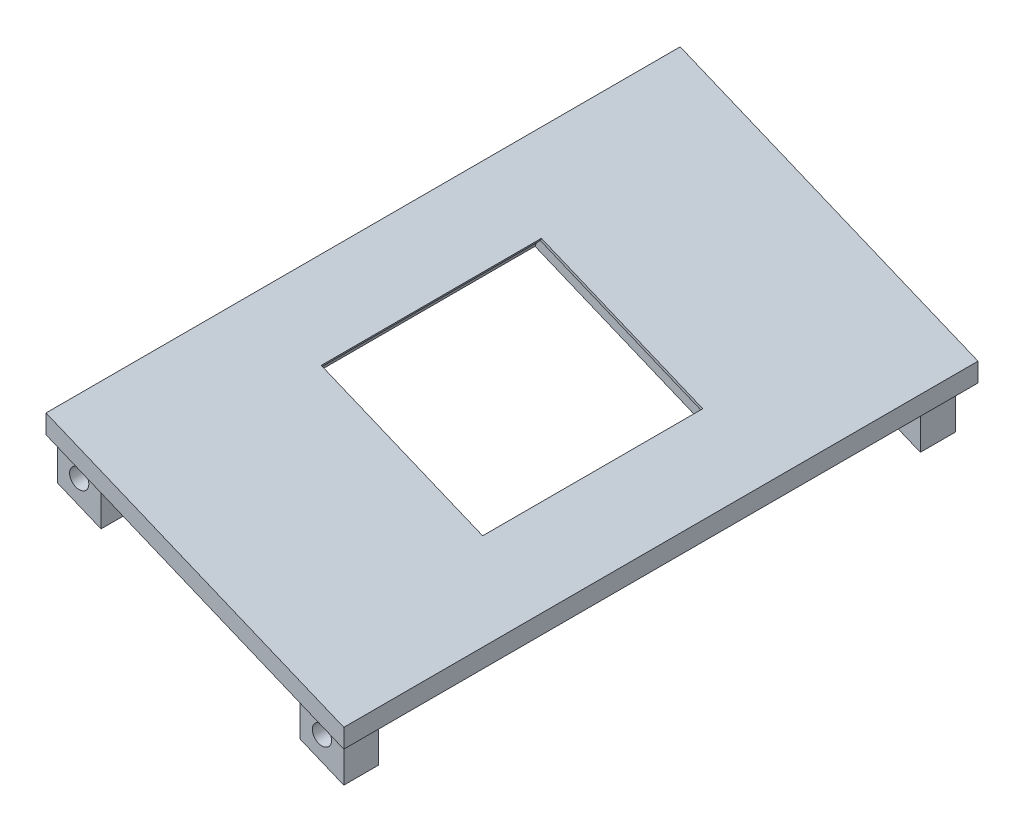
ISO-10303-21;
HEADER;
FILE_DESCRIPTION(('STEP AP214'),'2;1');
FILE_NAME('part.step','',(''),(''),'','','');
FILE_SCHEMA(('AUTOMOTIVE_DESIGN { 1 0 10303 214 1 1 1 1 }'));
ENDSEC;
DATA;
#1=APPLICATION_CONTEXT('core data for automotive mechanical design processes');
#2=APPLICATION_PROTOCOL_DEFINITION('international standard','automotive_design',2000,#1);
#3=PRODUCT_CONTEXT('',#1,'mechanical');
#4=PRODUCT('Part','Part','',(#3));
#5=PRODUCT_RELATED_PRODUCT_CATEGORY('part','',(#4));
#6=PRODUCT_DEFINITION_FORMATION('','',#4);
#7=PRODUCT_DEFINITION_CONTEXT('part definition',#1,'design');
#8=PRODUCT_DEFINITION('design','',#6,#7);
#9=PRODUCT_DEFINITION_SHAPE('','',#8);
#10=(LENGTH_UNIT() NAMED_UNIT(*) SI_UNIT(.MILLI.,.METRE.));
#11=(NAMED_UNIT(*) PLANE_ANGLE_UNIT() SI_UNIT($,.RADIAN.));
#12=(NAMED_UNIT(*) SI_UNIT($,.STERADIAN.) SOLID_ANGLE_UNIT());
#13=UNCERTAINTY_MEASURE_WITH_UNIT(LENGTH_MEASURE(1.E-05),#10,'distance_accuracy_value','');
#14=(GEOMETRIC_REPRESENTATION_CONTEXT(3) GLOBAL_UNCERTAINTY_ASSIGNED_CONTEXT((#13)) GLOBAL_UNIT_ASSIGNED_CONTEXT((#10,
#11,#12)) REPRESENTATION_CONTEXT('',''));
#15=CARTESIAN_POINT('',(0.,0.,0.));
#16=DIRECTION('',(0.,0.,1.));
#17=DIRECTION('',(1.,0.,0.));
#18=AXIS2_PLACEMENT_3D('',#15,#16,#17);
#19=CARTESIAN_POINT('',(10.,-14.9660576266548,-17.9995244627282));
#20=DIRECTION('',(-0.382683432365087,-0.923879532511288,0.));
#21=DIRECTION('',(0.923879532511288,-0.382683432365087,0.));
#22=AXIS2_PLACEMENT_3D('',#19,#20,#21);
#23=PLANE('',#22);
#24=DIRECTION('',(-0.923879532511288,0.382683432365087,0.));
#25=VECTOR('',#24,1.);
#26=CARTESIAN_POINT('',(-5.3575680531112,-8.60474465398847,2.6));
#27=LINE('',#26,#25);
#28=CARTESIAN_POINT('',(10.,-14.9660576266548,2.6));
#29=VERTEX_POINT('',#28);
#30=CARTESIAN_POINT('',(0.,-10.8239220029239,2.6));
#31=VERTEX_POINT('',#30);
#32=EDGE_CURVE('E300',#29,#31,#27,.T.);
#33=ORIENTED_EDGE('',*,*,#32,.F.);
#34=DIRECTION('',(0.,0.,1.));
#35=VECTOR('',#34,1.);
#36=CARTESIAN_POINT('',(10.,-14.9660576266548,-17.9995244627282));
#37=LINE('',#36,#35);
#38=CARTESIAN_POINT('',(10.,-14.9660576266548,10.6));
#39=VERTEX_POINT('',#38);
#40=EDGE_CURVE('E396',#29,#39,#37,.T.);
#41=ORIENTED_EDGE('',*,*,#40,.T.);
#42=DIRECTION('',(0.923879532511288,-0.382683432365087,0.));
#43=VECTOR('',#42,1.);
#44=CARTESIAN_POINT('',(-5.3575680531112,-8.60474465398847,10.6));
#45=LINE('',#44,#43);
#46=CARTESIAN_POINT('',(0.,-10.8239220029239,10.6));
#47=VERTEX_POINT('',#46);
#48=EDGE_CURVE('E307',#47,#39,#45,.T.);
#49=ORIENTED_EDGE('',*,*,#48,.F.);
#50=DIRECTION('',(0.,0.,1.));
#51=VECTOR('',#50,1.);
#52=CARTESIAN_POINT('',(0.,-10.8239220029239,-17.9995244627282));
#53=LINE('',#52,#51);
#54=EDGE_CURVE('E403',#31,#47,#53,.T.);
#55=ORIENTED_EDGE('',*,*,#54,.F.);
#56=EDGE_LOOP('',(#33,#41,#49,#55));
#57=FACE_BOUND('',#56,.T.);
#58=ADVANCED_FACE('F38',(#57),#23,.T.);
#59=CARTESIAN_POINT('',(10.,-4.14213562373091,-17.9995244627282));
#60=DIRECTION('',(1.,0.,0.));
#61=DIRECTION('',(0.,1.,0.));
#62=AXIS2_PLACEMENT_3D('',#59,#60,#61);
#63=PLANE('',#62);
#64=DIRECTION('',(0.,-1.,0.));
#65=VECTOR('',#64,1.);
#66=CARTESIAN_POINT('',(10.,-4.14213562373091,2.6));
#67=LINE('',#66,#65);
#68=CARTESIAN_POINT('',(10.,-4.14213562373091,2.6));
#69=VERTEX_POINT('',#68);
#70=EDGE_CURVE('E362',#69,#29,#67,.T.);
#71=ORIENTED_EDGE('',*,*,#70,.F.);
#72=DIRECTION('',(0.,0.,1.));
#73=VECTOR('',#72,1.);
#74=CARTESIAN_POINT('',(10.,-4.14213562373091,-17.9995244627282));
#75=LINE('',#74,#73);
#76=CARTESIAN_POINT('',(10.,-4.14213562373091,10.6));
#77=VERTEX_POINT('',#76);
#78=EDGE_CURVE('E395',#69,#77,#75,.T.);
#79=ORIENTED_EDGE('',*,*,#78,.T.);
#80=DIRECTION('',(0.,1.,0.));
#81=VECTOR('',#80,1.);
#82=CARTESIAN_POINT('',(10.,-4.14213562373091,10.6));
#83=LINE('',#82,#81);
#84=EDGE_CURVE('E336',#39,#77,#83,.T.);
#85=ORIENTED_EDGE('',*,*,#84,.F.);
#86=ORIENTED_EDGE('',*,*,#40,.F.);
#87=EDGE_LOOP('',(#71,#79,#85,#86));
#88=FACE_BOUND('',#87,.T.);
#89=ADVANCED_FACE('F456',(#88),#63,.T.);
#90=CARTESIAN_POINT('',(65.582309499333,-37.9890040492973,-17.9995244627282));
#91=DIRECTION('',(-0.382683432365088,-0.923879532511288,0.));
#92=DIRECTION('',(0.923879532511288,-0.382683432365088,0.));
#93=AXIS2_PLACEMENT_3D('',#90,#91,#92);
#94=PLANE('',#93);
#95=CARTESIAN_POINT('',(65.582309499333,-37.9890040492973,2.6));
#96=VERTEX_POINT('',#95);
#97=CARTESIAN_POINT('',(55.5823094993331,-33.8468684255664,2.6));
#98=VERTEX_POINT('',#97);
#99=EDGE_CURVE('E292',#96,#98,#27,.T.);
#100=ORIENTED_EDGE('',*,*,#99,.F.);
#101=DIRECTION('',(0.,0.,1.));
#102=VECTOR('',#101,1.);
#103=CARTESIAN_POINT('',(65.582309499333,-37.9890040492973,-17.9995244627282));
#104=LINE('',#103,#102);
#105=CARTESIAN_POINT('',(65.582309499333,-37.9890040492973,10.6));
#106=VERTEX_POINT('',#105);
#107=EDGE_CURVE('E383',#96,#106,#104,.T.);
#108=ORIENTED_EDGE('',*,*,#107,.T.);
#109=CARTESIAN_POINT('',(55.5823094993331,-33.8468684255664,10.6));
#110=VERTEX_POINT('',#109);
#111=EDGE_CURVE('E305',#110,#106,#45,.T.);
#112=ORIENTED_EDGE('',*,*,#111,.F.);
#113=DIRECTION('',(0.,0.,1.));
#114=VECTOR('',#113,1.);
#115=CARTESIAN_POINT('',(55.5823094993331,-33.8468684255664,-17.9995244627282));
#116=LINE('',#115,#114);
#117=EDGE_CURVE('E379',#98,#110,#116,.T.);
#118=ORIENTED_EDGE('',*,*,#117,.F.);
#119=EDGE_LOOP('',(#100,#108,#112,#118));
#120=FACE_BOUND('',#119,.T.);
#121=ADVANCED_FACE('F517',(#120),#94,.T.);
#122=CARTESIAN_POINT('',(65.582309499333,-27.1650820463734,-17.9995244627282));
#123=DIRECTION('',(1.,0.,0.));
#124=DIRECTION('',(0.,1.,0.));
#125=AXIS2_PLACEMENT_3D('',#122,#123,#124);
#126=PLANE('',#125);
#127=DIRECTION('',(0.,-1.,0.));
#128=VECTOR('',#127,1.);
#129=CARTESIAN_POINT('',(65.582309499333,-27.1650820463734,2.6));
#130=LINE('',#129,#128);
#131=CARTESIAN_POINT('',(65.582309499333,-27.1650820463734,2.6));
#132=VERTEX_POINT('',#131);
#133=EDGE_CURVE('E360',#132,#96,#130,.T.);
#134=ORIENTED_EDGE('',*,*,#133,.F.);
#135=DIRECTION('',(0.,0.,1.));
#136=VECTOR('',#135,1.);
#137=CARTESIAN_POINT('',(65.582309499333,-27.1650820463734,-17.9995244627282));
#138=LINE('',#137,#136);
#139=CARTESIAN_POINT('',(65.582309499333,-27.1650820463734,10.6));
#140=VERTEX_POINT('',#139);
#141=EDGE_CURVE('E384',#132,#140,#138,.T.);
#142=ORIENTED_EDGE('',*,*,#141,.T.);
#143=DIRECTION('',(0.,1.,0.));
#144=VECTOR('',#143,1.);
#145=CARTESIAN_POINT('',(65.582309499333,-27.1650820463734,10.6));
#146=LINE('',#145,#144);
#147=EDGE_CURVE('E334',#106,#140,#146,.T.);
#148=ORIENTED_EDGE('',*,*,#147,.F.);
#149=ORIENTED_EDGE('',*,*,#107,.F.);
#150=EDGE_LOOP('',(#134,#142,#148,#149));
#151=FACE_BOUND('',#150,.T.);
#152=ADVANCED_FACE('F576',(#151),#126,.T.);
#153=CARTESIAN_POINT('',(55.5823094993331,-33.8468684255664,-17.9995244627282));
#154=DIRECTION('',(-1.,0.,0.));
#155=DIRECTION('',(0.,0.,1.));
#156=AXIS2_PLACEMENT_3D('',#153,#154,#155);
#157=PLANE('',#156);
#158=DIRECTION('',(0.,1.,0.));
#159=VECTOR('',#158,1.);
#160=CARTESIAN_POINT('',(55.5823094993331,-33.8468684255664,2.6));
#161=LINE('',#160,#159);
#162=CARTESIAN_POINT('',(55.582309499333,-23.0229464226424,2.6));
#163=VERTEX_POINT('',#162);
#164=EDGE_CURVE('E358',#98,#163,#161,.T.);
#165=ORIENTED_EDGE('',*,*,#164,.F.);
#166=ORIENTED_EDGE('',*,*,#117,.T.);
#167=DIRECTION('',(0.,-1.,0.));
#168=VECTOR('',#167,1.);
#169=CARTESIAN_POINT('',(55.5823094993331,-33.8468684255664,10.6));
#170=LINE('',#169,#168);
#171=CARTESIAN_POINT('',(55.582309499333,-23.0229464226424,10.6));
#172=VERTEX_POINT('',#171);
#173=EDGE_CURVE('E332',#172,#110,#170,.T.);
#174=ORIENTED_EDGE('',*,*,#173,.F.);
#175=DIRECTION('',(0.,0.,1.));
#176=VECTOR('',#175,1.);
#177=CARTESIAN_POINT('',(55.5823094993331,-23.0229464226425,-17.9995244627282));
#178=LINE('',#177,#176);
#179=EDGE_CURVE('E388',#163,#172,#178,.T.);
#180=ORIENTED_EDGE('',*,*,#179,.F.);
#181=EDGE_LOOP('',(#165,#166,#174,#180));
#182=FACE_BOUND('',#181,.T.);
#183=ADVANCED_FACE('F510',(#182),#157,.T.);
#184=CARTESIAN_POINT('',(68.182309499333,-28.2420373085434,145.2));
#185=DIRECTION('',(0.382683432365087,0.923879532511288,0.));
#186=DIRECTION('',(-0.923879532511288,0.382683432365087,0.));
#187=AXIS2_PLACEMENT_3D('',#184,#185,#186);
#188=PLANE('',#187);
#189=DIRECTION('',(0.923879532511288,-0.382683432365087,0.));
#190=VECTOR('',#189,1.);
#191=CARTESIAN_POINT('',(13.1589508374691,-5.45061590348046,46.4));
#192=LINE('',#191,#190);
#193=CARTESIAN_POINT('',(13.1589508374691,-5.45061590348046,46.4));
#194=VERTEX_POINT('',#193);
#195=CARTESIAN_POINT('',(51.9618912029432,-21.5233200628141,46.4));
#196=VERTEX_POINT('',#195);
#197=EDGE_CURVE('E251',#194,#196,#192,.T.);
#198=ORIENTED_EDGE('',*,*,#197,.F.);
#199=DIRECTION('',(0.,0.,-1.));
#200=VECTOR('',#199,1.);
#201=CARTESIAN_POINT('',(13.1589508374691,-5.45061590348046,46.4));
#202=LINE('',#201,#200);
#203=CARTESIAN_POINT('',(13.1589508374691,-5.45061590348046,103.8));
#204=VERTEX_POINT('',#203);
#205=EDGE_CURVE('E53',#204,#194,#202,.T.);
#206=ORIENTED_EDGE('',*,*,#205,.F.);
#207=DIRECTION('',(-0.923879532511288,0.382683432365087,0.));
#208=VECTOR('',#207,1.);
#209=CARTESIAN_POINT('',(13.1589508374691,-5.45061590348046,103.8));
#210=LINE('',#209,#208);
#211=CARTESIAN_POINT('',(51.9618912029432,-21.5233200628141,103.8));
#212=VERTEX_POINT('',#211);
#213=EDGE_CURVE('E242',#212,#204,#210,.T.);
#214=ORIENTED_EDGE('',*,*,#213,.F.);
#215=DIRECTION('',(0.,0.,1.));
#216=VECTOR('',#215,1.);
#217=CARTESIAN_POINT('',(51.9618912029432,-21.5233200628141,46.4));
#218=LINE('',#217,#216);
#219=EDGE_CURVE('E245',#196,#212,#218,.T.);
#220=ORIENTED_EDGE('',*,*,#219,.F.);
#221=EDGE_LOOP('',(#198,#206,#214,#220));
#222=FACE_BOUND('',#221,.T.);
#223=DIRECTION('',(0.923879532511288,-0.382683432365087,0.));
#224=VECTOR('',#223,1.);
#225=CARTESIAN_POINT('',(68.182309499333,-28.2420373085434,0.));
#226=LINE('',#225,#224);
#227=CARTESIAN_POINT('',(0.,0.,0.));
#228=VERTEX_POINT('',#227);
#229=CARTESIAN_POINT('',(68.182309499333,-28.2420373085434,0.));
#230=VERTEX_POINT('',#229);
#231=EDGE_CURVE('E415',#228,#230,#226,.T.);
#232=ORIENTED_EDGE('',*,*,#231,.T.);
#233=DIRECTION('',(0.,0.,-1.));
#234=VECTOR('',#233,1.);
#235=CARTESIAN_POINT('',(68.182309499333,-28.2420373085434,145.2));
#236=LINE('',#235,#234);
#237=CARTESIAN_POINT('',(68.182309499333,-28.2420373085434,145.2));
#238=VERTEX_POINT('',#237);
#239=EDGE_CURVE('E46',#238,#230,#236,.T.);
#240=ORIENTED_EDGE('',*,*,#239,.F.);
#241=DIRECTION('',(0.923879532511288,-0.382683432365087,0.));
#242=VECTOR('',#241,1.);
#243=CARTESIAN_POINT('',(68.182309499333,-28.2420373085434,145.2));
#244=LINE('',#243,#242);
#245=CARTESIAN_POINT('',(0.,0.,145.2));
#246=VERTEX_POINT('',#245);
#247=EDGE_CURVE('E404',#246,#238,#244,.T.);
#248=ORIENTED_EDGE('',*,*,#247,.F.);
#249=DIRECTION('',(0.,0.,1.));
#250=VECTOR('',#249,1.);
#251=CARTESIAN_POINT('',(0.,0.,145.2));
#252=LINE('',#251,#250);
#253=CARTESIAN_POINT('',(0.,0.,142.6));
#254=VERTEX_POINT('',#253);
#255=EDGE_CURVE('E370',#254,#246,#252,.T.);
#256=ORIENTED_EDGE('',*,*,#255,.F.);
#257=DIRECTION('',(0.923879532511288,-0.382683432365087,0.));
#258=VECTOR('',#257,1.);
#259=CARTESIAN_POINT('',(69.4091438229839,-28.7502087241844,142.6));
#260=LINE('',#259,#258);
#261=CARTESIAN_POINT('',(10.,-4.1421356237309,142.6));
#262=VERTEX_POINT('',#261);
#263=EDGE_CURVE('E291',#254,#262,#260,.T.);
#264=ORIENTED_EDGE('',*,*,#263,.T.);
#265=CARTESIAN_POINT('',(10.,-4.14213562373091,134.6));
#266=VERTEX_POINT('',#265);
#267=EDGE_CURVE('E392',#266,#262,#75,.T.);
#268=ORIENTED_EDGE('',*,*,#267,.F.);
#269=DIRECTION('',(-0.923879532511288,0.382683432365087,0.));
#270=VECTOR('',#269,1.);
#271=CARTESIAN_POINT('',(-1.53073372946032,0.634050671124403,134.6));
#272=LINE('',#271,#270);
#273=CARTESIAN_POINT('',(0.,0.,134.6));
#274=VERTEX_POINT('',#273);
#275=EDGE_CURVE('E311',#266,#274,#272,.T.);
#276=ORIENTED_EDGE('',*,*,#275,.T.);
#277=DIRECTION('',(0.,0.,1.));
#278=VECTOR('',#277,1.);
#279=CARTESIAN_POINT('',(0.,0.,145.2));
#280=LINE('',#279,#278);
#281=CARTESIAN_POINT('',(0.,0.,10.6));
#282=VERTEX_POINT('',#281);
#283=EDGE_CURVE('E367',#282,#274,#280,.T.);
#284=ORIENTED_EDGE('',*,*,#283,.F.);
#285=DIRECTION('',(0.923879532511288,-0.382683432365087,0.));
#286=VECTOR('',#285,1.);
#287=CARTESIAN_POINT('',(-1.5307337294603,0.634050671124403,10.6));
#288=LINE('',#287,#286);
#289=EDGE_CURVE('E310',#282,#77,#288,.T.);
#290=ORIENTED_EDGE('',*,*,#289,.T.);
#291=ORIENTED_EDGE('',*,*,#78,.F.);
#292=DIRECTION('',(-0.923879532511288,0.382683432365087,0.));
#293=VECTOR('',#292,1.);
#294=CARTESIAN_POINT('',(-1.5307337294603,0.634050671124403,2.6));
#295=LINE('',#294,#293);
#296=CARTESIAN_POINT('',(0.,0.,2.6));
#297=VERTEX_POINT('',#296);
#298=EDGE_CURVE('E282',#69,#297,#295,.T.);
#299=ORIENTED_EDGE('',*,*,#298,.T.);
#300=DIRECTION('',(0.,0.,1.));
#301=VECTOR('',#300,1.);
#302=CARTESIAN_POINT('',(0.,0.,145.2));
#303=LINE('',#302,#301);
#304=EDGE_CURVE('E373',#228,#297,#303,.T.);
#305=ORIENTED_EDGE('',*,*,#304,.F.);
#306=EDGE_LOOP('',(#232,#240,#248,#256,#264,#268,#276,#284,#290,#291,#299,#305));
#307=FACE_BOUND('',#306,.T.);
#308=CARTESIAN_POINT('',(55.5823094993331,-23.0229464226425,142.6));
#309=VERTEX_POINT('',#308);
#310=CARTESIAN_POINT('',(65.582309499333,-27.1650820463733,142.6));
#311=VERTEX_POINT('',#310);
#312=EDGE_CURVE('E288',#309,#311,#260,.T.);
#313=ORIENTED_EDGE('',*,*,#312,.T.);
#314=CARTESIAN_POINT('',(65.582309499333,-27.1650820463734,134.6));
#315=VERTEX_POINT('',#314);
#316=EDGE_CURVE('E385',#315,#311,#138,.T.);
#317=ORIENTED_EDGE('',*,*,#316,.F.);
#318=CARTESIAN_POINT('',(55.5823094993331,-23.0229464226425,134.6));
#319=VERTEX_POINT('',#318);
#320=EDGE_CURVE('E314',#315,#319,#272,.T.);
#321=ORIENTED_EDGE('',*,*,#320,.T.);
#322=EDGE_CURVE('E389',#319,#309,#178,.T.);
#323=ORIENTED_EDGE('',*,*,#322,.T.);
#324=EDGE_LOOP('',(#313,#317,#321,#323));
#325=FACE_BOUND('',#324,.T.);
#326=ORIENTED_EDGE('',*,*,#141,.F.);
#327=EDGE_CURVE('E298',#132,#163,#295,.T.);
#328=ORIENTED_EDGE('',*,*,#327,.T.);
#329=ORIENTED_EDGE('',*,*,#179,.T.);
#330=EDGE_CURVE('E303',#172,#140,#288,.T.);
#331=ORIENTED_EDGE('',*,*,#330,.T.);
#332=EDGE_LOOP('',(#326,#328,#329,#331));
#333=FACE_BOUND('',#332,.T.);
#334=ADVANCED_FACE('F40',(#222,#307,#325,#333),#188,.F.);
#335=CARTESIAN_POINT('',(68.1823094993331,-23.9124685073738,145.2));
#336=DIRECTION('',(-1.,0.,0.));
#337=DIRECTION('',(0.,-1.,0.));
#338=AXIS2_PLACEMENT_3D('',#335,#336,#337);
#339=PLANE('',#338);
#340=DIRECTION('',(0.,1.,0.));
#341=VECTOR('',#340,1.);
#342=CARTESIAN_POINT('',(68.1823094993331,-23.9124685073738,0.));
#343=LINE('',#342,#341);
#344=CARTESIAN_POINT('',(68.1823094993331,-23.9124685073738,0.));
#345=VERTEX_POINT('',#344);
#346=EDGE_CURVE('E418',#230,#345,#343,.T.);
#347=ORIENTED_EDGE('',*,*,#346,.T.);
#348=DIRECTION('',(0.,0.,-1.));
#349=VECTOR('',#348,1.);
#350=CARTESIAN_POINT('',(68.1823094993331,-23.9124685073738,145.2));
#351=LINE('',#350,#349);
#352=CARTESIAN_POINT('',(68.1823094993331,-23.9124685073738,145.2));
#353=VERTEX_POINT('',#352);
#354=EDGE_CURVE('E426',#353,#345,#351,.T.);
#355=ORIENTED_EDGE('',*,*,#354,.F.);
#356=DIRECTION('',(0.,1.,0.));
#357=VECTOR('',#356,1.);
#358=CARTESIAN_POINT('',(68.1823094993331,-23.9124685073738,145.2));
#359=LINE('',#358,#357);
#360=EDGE_CURVE('E406',#238,#353,#359,.T.);
#361=ORIENTED_EDGE('',*,*,#360,.F.);
#362=ORIENTED_EDGE('',*,*,#239,.T.);
#363=EDGE_LOOP('',(#347,#355,#361,#362));
#364=FACE_BOUND('',#363,.T.);
#365=ADVANCED_FACE('F502',(#364),#339,.F.);
#366=CARTESIAN_POINT('',(0.,4.32956880116957,145.2));
#367=DIRECTION('',(-0.382683432365087,-0.923879532511288,0.));
#368=DIRECTION('',(0.923879532511288,-0.382683432365087,0.));
#369=AXIS2_PLACEMENT_3D('',#366,#367,#368);
#370=PLANE('',#369);
#371=DIRECTION('',(0.923879532511288,-0.382683432365087,0.));
#372=VECTOR('',#371,1.);
#373=CARTESIAN_POINT('',(15.6135640994408,-2.1377812058004,97.8));
#374=LINE('',#373,#372);
#375=CARTESIAN_POINT('',(15.6135640994408,-2.1377812058004,97.8));
#376=VERTEX_POINT('',#375);
#377=CARTESIAN_POINT('',(52.5687453998923,-17.4451185004039,97.8));
#378=VERTEX_POINT('',#377);
#379=EDGE_CURVE('E270',#376,#378,#374,.T.);
#380=ORIENTED_EDGE('',*,*,#379,.F.);
#381=DIRECTION('',(0.,0.,1.));
#382=VECTOR('',#381,1.);
#383=CARTESIAN_POINT('',(15.6135640994408,-2.13778120580039,47.4));
#384=LINE('',#383,#382);
#385=CARTESIAN_POINT('',(15.6135640994408,-2.13778120580039,47.4));
#386=VERTEX_POINT('',#385);
#387=EDGE_CURVE('E267',#386,#376,#384,.T.);
#388=ORIENTED_EDGE('',*,*,#387,.F.);
#389=DIRECTION('',(-0.923879532511288,0.382683432365087,0.));
#390=VECTOR('',#389,1.);
#391=CARTESIAN_POINT('',(15.6135640994408,-2.13778120580039,47.4));
#392=LINE('',#391,#390);
#393=CARTESIAN_POINT('',(52.5687453998923,-17.4451185004039,47.4));
#394=VERTEX_POINT('',#393);
#395=EDGE_CURVE('E276',#394,#386,#392,.T.);
#396=ORIENTED_EDGE('',*,*,#395,.F.);
#397=DIRECTION('',(0.,0.,-1.));
#398=VECTOR('',#397,1.);
#399=CARTESIAN_POINT('',(52.5687453998923,-17.4451185004039,47.4));
#400=LINE('',#399,#398);
#401=EDGE_CURVE('E273',#378,#394,#400,.T.);
#402=ORIENTED_EDGE('',*,*,#401,.F.);
#403=EDGE_LOOP('',(#380,#388,#396,#402));
#404=FACE_BOUND('',#403,.T.);
#405=DIRECTION('',(-0.923879532511288,0.382683432365087,0.));
#406=VECTOR('',#405,1.);
#407=CARTESIAN_POINT('',(0.,4.32956880116957,0.));
#408=LINE('',#407,#406);
#409=CARTESIAN_POINT('',(0.,4.32956880116957,0.));
#410=VERTEX_POINT('',#409);
#411=EDGE_CURVE('E420',#345,#410,#408,.T.);
#412=ORIENTED_EDGE('',*,*,#411,.T.);
#413=DIRECTION('',(0.,0.,-1.));
#414=VECTOR('',#413,1.);
#415=CARTESIAN_POINT('',(0.,4.32956880116957,145.2));
#416=LINE('',#415,#414);
#417=CARTESIAN_POINT('',(0.,4.32956880116957,145.2));
#418=VERTEX_POINT('',#417);
#419=EDGE_CURVE('E414',#418,#410,#416,.T.);
#420=ORIENTED_EDGE('',*,*,#419,.F.);
#421=DIRECTION('',(-0.923879532511288,0.382683432365087,0.));
#422=VECTOR('',#421,1.);
#423=CARTESIAN_POINT('',(0.,4.32956880116957,145.2));
#424=LINE('',#423,#422);
#425=EDGE_CURVE('E409',#353,#418,#424,.T.);
#426=ORIENTED_EDGE('',*,*,#425,.F.);
#427=ORIENTED_EDGE('',*,*,#354,.T.);
#428=EDGE_LOOP('',(#412,#420,#426,#427));
#429=FACE_BOUND('',#428,.T.);
#430=ADVANCED_FACE('F494',(#404,#429),#370,.F.);
#431=CARTESIAN_POINT('',(0.,0.,145.2));
#432=DIRECTION('',(1.,0.,0.));
#433=DIRECTION('',(0.,1.,0.));
#434=AXIS2_PLACEMENT_3D('',#431,#432,#433);
#435=PLANE('',#434);
#436=DIRECTION('',(0.,-1.,0.));
#437=VECTOR('',#436,1.);
#438=CARTESIAN_POINT('',(0.,0.,0.));
#439=LINE('',#438,#437);
#440=EDGE_CURVE('E407',#410,#228,#439,.T.);
#441=ORIENTED_EDGE('',*,*,#440,.T.);
#442=ORIENTED_EDGE('',*,*,#304,.T.);
#443=DIRECTION('',(0.,-1.,0.));
#444=VECTOR('',#443,1.);
#445=CARTESIAN_POINT('',(0.,0.,2.59999999999999));
#446=LINE('',#445,#444);
#447=EDGE_CURVE('E364',#297,#31,#446,.T.);
#448=ORIENTED_EDGE('',*,*,#447,.T.);
#449=ORIENTED_EDGE('',*,*,#54,.T.);
#450=DIRECTION('',(0.,1.,0.));
#451=VECTOR('',#450,1.);
#452=CARTESIAN_POINT('',(0.,0.,10.6));
#453=LINE('',#452,#451);
#454=EDGE_CURVE('E338',#47,#282,#453,.T.);
#455=ORIENTED_EDGE('',*,*,#454,.T.);
#456=ORIENTED_EDGE('',*,*,#283,.T.);
#457=DIRECTION('',(0.,-1.,0.));
#458=VECTOR('',#457,1.);
#459=CARTESIAN_POINT('',(0.,0.,134.6));
#460=LINE('',#459,#458);
#461=CARTESIAN_POINT('',(0.,-10.8239220029239,134.6));
#462=VERTEX_POINT('',#461);
#463=EDGE_CURVE('E325',#274,#462,#460,.T.);
#464=ORIENTED_EDGE('',*,*,#463,.T.);
#465=CARTESIAN_POINT('',(0.,-10.8239220029239,142.6));
#466=VERTEX_POINT('',#465);
#467=EDGE_CURVE('E400',#462,#466,#53,.T.);
#468=ORIENTED_EDGE('',*,*,#467,.T.);
#469=DIRECTION('',(0.,1.,0.));
#470=VECTOR('',#469,1.);
#471=CARTESIAN_POINT('',(0.,0.,142.6));
#472=LINE('',#471,#470);
#473=EDGE_CURVE('E351',#466,#254,#472,.T.);
#474=ORIENTED_EDGE('',*,*,#473,.T.);
#475=ORIENTED_EDGE('',*,*,#255,.T.);
#476=DIRECTION('',(0.,-1.,0.));
#477=VECTOR('',#476,1.);
#478=CARTESIAN_POINT('',(0.,0.,145.2));
#479=LINE('',#478,#477);
#480=EDGE_CURVE('E411',#418,#246,#479,.T.);
#481=ORIENTED_EDGE('',*,*,#480,.F.);
#482=ORIENTED_EDGE('',*,*,#419,.T.);
#483=EDGE_LOOP('',(#441,#442,#448,#449,#455,#456,#464,#468,#474,#475,#481,#482));
#484=FACE_BOUND('',#483,.T.);
#485=ADVANCED_FACE('F467',(#484),#435,.F.);
#486=CARTESIAN_POINT('',(0.,0.,145.2));
#487=DIRECTION('',(0.,0.,-1.));
#488=DIRECTION('',(-1.,0.,0.));
#489=AXIS2_PLACEMENT_3D('',#486,#487,#488);
#490=PLANE('',#489);
#491=ORIENTED_EDGE('',*,*,#480,.T.);
#492=ORIENTED_EDGE('',*,*,#247,.T.);
#493=ORIENTED_EDGE('',*,*,#360,.T.);
#494=ORIENTED_EDGE('',*,*,#425,.T.);
#495=EDGE_LOOP('',(#491,#492,#493,#494));
#496=FACE_BOUND('',#495,.T.);
#497=ADVANCED_FACE('F488',(#496),#490,.F.);
#498=CARTESIAN_POINT('',(0.,0.,0.));
#499=DIRECTION('',(0.,0.,-1.));
#500=DIRECTION('',(-1.,0.,0.));
#501=AXIS2_PLACEMENT_3D('',#498,#499,#500);
#502=PLANE('',#501);
#503=ORIENTED_EDGE('',*,*,#231,.F.);
#504=ORIENTED_EDGE('',*,*,#440,.F.);
#505=ORIENTED_EDGE('',*,*,#411,.F.);
#506=ORIENTED_EDGE('',*,*,#346,.F.);
#507=EDGE_LOOP('',(#503,#504,#505,#506));
#508=FACE_BOUND('',#507,.T.);
#509=ADVANCED_FACE('F498',(#508),#502,.T.);
#510=DIRECTION('',(0.923879532511288,-0.382683432365087,0.));
#511=VECTOR('',#510,1.);
#512=CARTESIAN_POINT('',(65.582309499333,-37.9890040492973,142.6));
#513=LINE('',#512,#511);
#514=CARTESIAN_POINT('',(10.,-14.9660576266548,142.6));
#515=VERTEX_POINT('',#514);
#516=EDGE_CURVE('E295',#466,#515,#513,.T.);
#517=ORIENTED_EDGE('',*,*,#516,.F.);
#518=ORIENTED_EDGE('',*,*,#467,.F.);
#519=DIRECTION('',(-0.923879532511288,0.382683432365087,0.));
#520=VECTOR('',#519,1.);
#521=CARTESIAN_POINT('',(-5.35756805311121,-8.60474465398846,134.6));
#522=LINE('',#521,#520);
#523=CARTESIAN_POINT('',(10.,-14.9660576266548,134.6));
#524=VERTEX_POINT('',#523);
#525=EDGE_CURVE('E304',#524,#462,#522,.T.);
#526=ORIENTED_EDGE('',*,*,#525,.F.);
#527=EDGE_CURVE('E397',#524,#515,#37,.T.);
#528=ORIENTED_EDGE('',*,*,#527,.T.);
#529=EDGE_LOOP('',(#517,#518,#526,#528));
#530=FACE_BOUND('',#529,.T.);
#531=ADVANCED_FACE('F478',(#530),#23,.T.);
#532=DIRECTION('',(0.,1.,0.));
#533=VECTOR('',#532,1.);
#534=CARTESIAN_POINT('',(10.,-4.14213562373091,142.6));
#535=LINE('',#534,#533);
#536=EDGE_CURVE('E349',#515,#262,#535,.T.);
#537=ORIENTED_EDGE('',*,*,#536,.F.);
#538=ORIENTED_EDGE('',*,*,#527,.F.);
#539=DIRECTION('',(0.,-1.,0.));
#540=VECTOR('',#539,1.);
#541=CARTESIAN_POINT('',(10.,-4.14213562373091,134.6));
#542=LINE('',#541,#540);
#543=EDGE_CURVE('E323',#266,#524,#542,.T.);
#544=ORIENTED_EDGE('',*,*,#543,.F.);
#545=ORIENTED_EDGE('',*,*,#267,.T.);
#546=EDGE_LOOP('',(#537,#538,#544,#545));
#547=FACE_BOUND('',#546,.T.);
#548=ADVANCED_FACE('F484',(#547),#63,.T.);
#549=CARTESIAN_POINT('',(55.5823094993331,-33.8468684255664,142.6));
#550=VERTEX_POINT('',#549);
#551=CARTESIAN_POINT('',(65.582309499333,-37.9890040492973,142.6));
#552=VERTEX_POINT('',#551);
#553=EDGE_CURVE('E293',#550,#552,#513,.T.);
#554=ORIENTED_EDGE('',*,*,#553,.F.);
#555=CARTESIAN_POINT('',(55.5823094993331,-33.8468684255664,134.6));
#556=VERTEX_POINT('',#555);
#557=EDGE_CURVE('E376',#556,#550,#116,.T.);
#558=ORIENTED_EDGE('',*,*,#557,.F.);
#559=CARTESIAN_POINT('',(65.582309499333,-37.9890040492973,134.6));
#560=VERTEX_POINT('',#559);
#561=EDGE_CURVE('E301',#560,#556,#522,.T.);
#562=ORIENTED_EDGE('',*,*,#561,.F.);
#563=EDGE_CURVE('E380',#560,#552,#104,.T.);
#564=ORIENTED_EDGE('',*,*,#563,.T.);
#565=EDGE_LOOP('',(#554,#558,#562,#564));
#566=FACE_BOUND('',#565,.T.);
#567=ADVANCED_FACE('F525',(#566),#94,.T.);
#568=DIRECTION('',(0.,1.,0.));
#569=VECTOR('',#568,1.);
#570=CARTESIAN_POINT('',(65.582309499333,-27.1650820463734,142.6));
#571=LINE('',#570,#569);
#572=EDGE_CURVE('E347',#552,#311,#571,.T.);
#573=ORIENTED_EDGE('',*,*,#572,.F.);
#574=ORIENTED_EDGE('',*,*,#563,.F.);
#575=DIRECTION('',(0.,-1.,0.));
#576=VECTOR('',#575,1.);
#577=CARTESIAN_POINT('',(65.582309499333,-27.1650820463734,134.6));
#578=LINE('',#577,#576);
#579=EDGE_CURVE('E321',#315,#560,#578,.T.);
#580=ORIENTED_EDGE('',*,*,#579,.F.);
#581=ORIENTED_EDGE('',*,*,#316,.T.);
#582=EDGE_LOOP('',(#573,#574,#580,#581));
#583=FACE_BOUND('',#582,.T.);
#584=ADVANCED_FACE('F563',(#583),#126,.T.);
#585=DIRECTION('',(0.,-1.,0.));
#586=VECTOR('',#585,1.);
#587=CARTESIAN_POINT('',(55.5823094993331,-33.8468684255664,142.6));
#588=LINE('',#587,#586);
#589=EDGE_CURVE('E345',#309,#550,#588,.T.);
#590=ORIENTED_EDGE('',*,*,#589,.F.);
#591=ORIENTED_EDGE('',*,*,#322,.F.);
#592=DIRECTION('',(0.,1.,0.));
#593=VECTOR('',#592,1.);
#594=CARTESIAN_POINT('',(55.5823094993331,-33.8468684255664,134.6));
#595=LINE('',#594,#593);
#596=EDGE_CURVE('E318',#556,#319,#595,.T.);
#597=ORIENTED_EDGE('',*,*,#596,.F.);
#598=ORIENTED_EDGE('',*,*,#557,.T.);
#599=EDGE_LOOP('',(#590,#591,#597,#598));
#600=FACE_BOUND('',#599,.T.);
#601=ADVANCED_FACE('F573',(#600),#157,.T.);
#602=CARTESIAN_POINT('',(54.2832230058275,135.380861991163,134.6));
#603=DIRECTION('',(0.,0.,1.));
#604=DIRECTION('',(1.,0.,0.));
#605=AXIS2_PLACEMENT_3D('',#602,#603,#604);
#606=PLANE('',#605);
#607=CARTESIAN_POINT('',(5.,-7.48302881332742,134.6));
#608=DIRECTION('',(0.,0.,1.));
#609=DIRECTION('',(1.,0.,0.));
#610=AXIS2_PLACEMENT_3D('',#607,#608,#609);
#611=CIRCLE('',#610,2.2);
#612=CARTESIAN_POINT('',(7.2,-7.48302881332742,134.6));
#613=VERTEX_POINT('',#612);
#614=EDGE_CURVE('E319',#613,#613,#611,.F.);
#615=ORIENTED_EDGE('',*,*,#614,.F.);
#616=EDGE_LOOP('',(#615));
#617=FACE_BOUND('',#616,.T.);
#618=ORIENTED_EDGE('',*,*,#275,.F.);
#619=ORIENTED_EDGE('',*,*,#543,.T.);
#620=ORIENTED_EDGE('',*,*,#525,.T.);
#621=ORIENTED_EDGE('',*,*,#463,.F.);
#622=EDGE_LOOP('',(#618,#619,#620,#621));
#623=FACE_BOUND('',#622,.T.);
#624=ADVANCED_FACE('F472',(#617,#623),#606,.F.);
#625=CARTESIAN_POINT('',(54.2832230058275,135.380861991163,10.6));
#626=DIRECTION('',(0.,0.,-1.));
#627=DIRECTION('',(-1.,0.,0.));
#628=AXIS2_PLACEMENT_3D('',#625,#626,#627);
#629=PLANE('',#628);
#630=CARTESIAN_POINT('',(5.,-7.48302881332742,10.6));
#631=DIRECTION('',(0.,0.,-1.));
#632=DIRECTION('',(-1.,0.,0.));
#633=AXIS2_PLACEMENT_3D('',#630,#631,#632);
#634=CIRCLE('',#633,2.2);
#635=CARTESIAN_POINT('',(2.8,-7.48302881332742,10.6));
#636=VERTEX_POINT('',#635);
#637=EDGE_CURVE('E328',#636,#636,#634,.F.);
#638=ORIENTED_EDGE('',*,*,#637,.F.);
#639=EDGE_LOOP('',(#638));
#640=FACE_BOUND('',#639,.T.);
#641=ORIENTED_EDGE('',*,*,#48,.T.);
#642=ORIENTED_EDGE('',*,*,#84,.T.);
#643=ORIENTED_EDGE('',*,*,#289,.F.);
#644=ORIENTED_EDGE('',*,*,#454,.F.);
#645=EDGE_LOOP('',(#641,#642,#643,#644));
#646=FACE_BOUND('',#645,.T.);
#647=ADVANCED_FACE('F463',(#640,#646),#629,.F.);
#648=CARTESIAN_POINT('',(5.,-7.48302881332742,0.));
#649=DIRECTION('',(0.,0.,1.));
#650=DIRECTION('',(1.,0.,0.));
#651=AXIS2_PLACEMENT_3D('',#648,#649,#650);
#652=CYLINDRICAL_SURFACE('',#651,2.2);
#653=CARTESIAN_POINT('',(5.,-7.48302881332742,2.6));
#654=DIRECTION('',(0.,0.,1.));
#655=DIRECTION('',(1.,0.,0.));
#656=AXIS2_PLACEMENT_3D('',#653,#654,#655);
#657=CIRCLE('',#656,2.2);
#658=CARTESIAN_POINT('',(7.2,-7.48302881332742,2.6));
#659=VERTEX_POINT('',#658);
#660=EDGE_CURVE('E354',#659,#659,#657,.F.);
#661=ORIENTED_EDGE('',*,*,#660,.T.);
#662=EDGE_LOOP('',(#661));
#663=FACE_BOUND('',#662,.T.);
#664=ORIENTED_EDGE('',*,*,#637,.T.);
#665=EDGE_LOOP('',(#664));
#666=FACE_BOUND('',#665,.T.);
#667=ADVANCED_FACE('F438',(#663,#666),#652,.F.);
#668=CARTESIAN_POINT('',(125.223100558272,105.996602595854,142.6));
#669=DIRECTION('',(0.,0.,-1.));
#670=DIRECTION('',(-1.,0.,0.));
#671=AXIS2_PLACEMENT_3D('',#668,#669,#670);
#672=PLANE('',#671);
#673=CARTESIAN_POINT('',(5.,-7.48302881332742,142.6));
#674=DIRECTION('',(0.,0.,-1.));
#675=DIRECTION('',(-1.,0.,0.));
#676=AXIS2_PLACEMENT_3D('',#673,#674,#675);
#677=CIRCLE('',#676,2.2);
#678=CARTESIAN_POINT('',(2.8,-7.48302881332742,142.6));
#679=VERTEX_POINT('',#678);
#680=EDGE_CURVE('E341',#679,#679,#677,.F.);
#681=ORIENTED_EDGE('',*,*,#680,.F.);
#682=EDGE_LOOP('',(#681));
#683=FACE_BOUND('',#682,.T.);
#684=ORIENTED_EDGE('',*,*,#516,.T.);
#685=ORIENTED_EDGE('',*,*,#536,.T.);
#686=ORIENTED_EDGE('',*,*,#263,.F.);
#687=ORIENTED_EDGE('',*,*,#473,.F.);
#688=EDGE_LOOP('',(#684,#685,#686,#687));
#689=FACE_BOUND('',#688,.T.);
#690=ADVANCED_FACE('F445',(#683,#689),#672,.F.);
#691=CARTESIAN_POINT('',(54.2832230058275,135.380861991163,2.6));
#692=DIRECTION('',(0.,0.,1.));
#693=DIRECTION('',(1.,0.,0.));
#694=AXIS2_PLACEMENT_3D('',#691,#692,#693);
#695=PLANE('',#694);
#696=ORIENTED_EDGE('',*,*,#660,.F.);
#697=EDGE_LOOP('',(#696));
#698=FACE_BOUND('',#697,.T.);
#699=ORIENTED_EDGE('',*,*,#298,.F.);
#700=ORIENTED_EDGE('',*,*,#70,.T.);
#701=ORIENTED_EDGE('',*,*,#32,.T.);
#702=ORIENTED_EDGE('',*,*,#447,.F.);
#703=EDGE_LOOP('',(#699,#700,#701,#702));
#704=FACE_BOUND('',#703,.T.);
#705=ADVANCED_FACE('F441',(#698,#704),#695,.F.);
#706=ORIENTED_EDGE('',*,*,#147,.T.);
#707=ORIENTED_EDGE('',*,*,#330,.F.);
#708=ORIENTED_EDGE('',*,*,#173,.T.);
#709=ORIENTED_EDGE('',*,*,#111,.T.);
#710=EDGE_LOOP('',(#706,#707,#708,#709));
#711=FACE_BOUND('',#710,.T.);
#712=CARTESIAN_POINT('',(60.582309499333,-30.5059752359699,10.6));
#713=DIRECTION('',(0.,0.,-1.));
#714=DIRECTION('',(-1.,0.,0.));
#715=AXIS2_PLACEMENT_3D('',#712,#713,#714);
#716=CIRCLE('',#715,2.20000000000001);
#717=CARTESIAN_POINT('',(58.382309499333,-30.5059752359699,10.6));
#718=VERTEX_POINT('',#717);
#719=EDGE_CURVE('E329',#718,#718,#716,.F.);
#720=ORIENTED_EDGE('',*,*,#719,.F.);
#721=EDGE_LOOP('',(#720));
#722=FACE_BOUND('',#721,.T.);
#723=ADVANCED_FACE('F444',(#711,#722),#629,.F.);
#724=ORIENTED_EDGE('',*,*,#579,.T.);
#725=ORIENTED_EDGE('',*,*,#561,.T.);
#726=ORIENTED_EDGE('',*,*,#596,.T.);
#727=ORIENTED_EDGE('',*,*,#320,.F.);
#728=EDGE_LOOP('',(#724,#725,#726,#727));
#729=FACE_BOUND('',#728,.T.);
#730=CARTESIAN_POINT('',(60.582309499333,-30.5059752359699,134.6));
#731=DIRECTION('',(0.,0.,1.));
#732=DIRECTION('',(1.,0.,0.));
#733=AXIS2_PLACEMENT_3D('',#730,#731,#732);
#734=CIRCLE('',#733,2.20000000000001);
#735=CARTESIAN_POINT('',(62.7823094993331,-30.5059752359699,134.6));
#736=VERTEX_POINT('',#735);
#737=EDGE_CURVE('E315',#736,#736,#734,.F.);
#738=ORIENTED_EDGE('',*,*,#737,.F.);
#739=EDGE_LOOP('',(#738));
#740=FACE_BOUND('',#739,.T.);
#741=ADVANCED_FACE('F595',(#729,#740),#606,.F.);
#742=CARTESIAN_POINT('',(60.582309499333,-30.5059752359699,0.));
#743=DIRECTION('',(0.,0.,1.));
#744=DIRECTION('',(1.,0.,0.));
#745=AXIS2_PLACEMENT_3D('',#742,#743,#744);
#746=CYLINDRICAL_SURFACE('',#745,2.20000000000001);
#747=CARTESIAN_POINT('',(60.582309499333,-30.5059752359699,2.6));
#748=DIRECTION('',(0.,0.,1.));
#749=DIRECTION('',(1.,0.,0.));
#750=AXIS2_PLACEMENT_3D('',#747,#748,#749);
#751=CIRCLE('',#750,2.20000000000001);
#752=CARTESIAN_POINT('',(62.7823094993331,-30.5059752359699,2.6));
#753=VERTEX_POINT('',#752);
#754=EDGE_CURVE('E355',#753,#753,#751,.F.);
#755=ORIENTED_EDGE('',*,*,#754,.T.);
#756=EDGE_LOOP('',(#755));
#757=FACE_BOUND('',#756,.T.);
#758=ORIENTED_EDGE('',*,*,#719,.T.);
#759=EDGE_LOOP('',(#758));
#760=FACE_BOUND('',#759,.T.);
#761=ADVANCED_FACE('F645',(#757,#760),#746,.F.);
#762=ORIENTED_EDGE('',*,*,#572,.T.);
#763=ORIENTED_EDGE('',*,*,#312,.F.);
#764=ORIENTED_EDGE('',*,*,#589,.T.);
#765=ORIENTED_EDGE('',*,*,#553,.T.);
#766=EDGE_LOOP('',(#762,#763,#764,#765));
#767=FACE_BOUND('',#766,.T.);
#768=CARTESIAN_POINT('',(60.582309499333,-30.5059752359699,142.6));
#769=DIRECTION('',(0.,0.,-1.));
#770=DIRECTION('',(-1.,0.,0.));
#771=AXIS2_PLACEMENT_3D('',#768,#769,#770);
#772=CIRCLE('',#771,2.20000000000001);
#773=CARTESIAN_POINT('',(58.382309499333,-30.5059752359699,142.6));
#774=VERTEX_POINT('',#773);
#775=EDGE_CURVE('E342',#774,#774,#772,.F.);
#776=ORIENTED_EDGE('',*,*,#775,.F.);
#777=EDGE_LOOP('',(#776));
#778=FACE_BOUND('',#777,.T.);
#779=ADVANCED_FACE('F623',(#767,#778),#672,.F.);
#780=ORIENTED_EDGE('',*,*,#133,.T.);
#781=ORIENTED_EDGE('',*,*,#99,.T.);
#782=ORIENTED_EDGE('',*,*,#164,.T.);
#783=ORIENTED_EDGE('',*,*,#327,.F.);
#784=EDGE_LOOP('',(#780,#781,#782,#783));
#785=FACE_BOUND('',#784,.T.);
#786=ORIENTED_EDGE('',*,*,#754,.F.);
#787=EDGE_LOOP('',(#786));
#788=FACE_BOUND('',#787,.T.);
#789=ADVANCED_FACE('F447',(#785,#788),#695,.F.);
#790=ORIENTED_EDGE('',*,*,#680,.T.);
#791=EDGE_LOOP('',(#790));
#792=FACE_BOUND('',#791,.T.);
#793=ORIENTED_EDGE('',*,*,#614,.T.);
#794=EDGE_LOOP('',(#793));
#795=FACE_BOUND('',#794,.T.);
#796=ADVANCED_FACE('F613',(#792,#795),#652,.F.);
#797=ORIENTED_EDGE('',*,*,#775,.T.);
#798=EDGE_LOOP('',(#797));
#799=FACE_BOUND('',#798,.T.);
#800=ORIENTED_EDGE('',*,*,#737,.T.);
#801=EDGE_LOOP('',(#800));
#802=FACE_BOUND('',#801,.T.);
#803=ADVANCED_FACE('F656',(#799,#802),#746,.F.);
#804=CARTESIAN_POINT('',(0.651689183089849,-38.2589425473849,47.4));
#805=DIRECTION('',(-0.923879532511288,0.382683432365087,0.));
#806=DIRECTION('',(-0.382683432365087,-0.923879532511288,0.));
#807=AXIS2_PLACEMENT_3D('',#804,#805,#806);
#808=PLANE('',#807);
#809=DIRECTION('',(0.382683432365087,0.923879532511288,0.));
#810=VECTOR('',#809,1.);
#811=CARTESIAN_POINT('',(0.651689183089856,-38.2589425473849,97.8));
#812=LINE('',#811,#810);
#813=CARTESIAN_POINT('',(15.3839540400217,-2.69210892530717,97.8));
#814=VERTEX_POINT('',#813);
#815=EDGE_CURVE('E279',#814,#376,#812,.T.);
#816=ORIENTED_EDGE('',*,*,#815,.F.);
#817=DIRECTION('',(0.,0.,-1.));
#818=VECTOR('',#817,1.);
#819=CARTESIAN_POINT('',(15.3839540400217,-2.69210892530717,47.4));
#820=LINE('',#819,#818);
#821=CARTESIAN_POINT('',(15.3839540400217,-2.69210892530717,47.4));
#822=VERTEX_POINT('',#821);
#823=EDGE_CURVE('E61',#814,#822,#820,.T.);
#824=ORIENTED_EDGE('',*,*,#823,.T.);
#825=DIRECTION('',(0.382683432365087,0.923879532511288,0.));
#826=VECTOR('',#825,1.);
#827=CARTESIAN_POINT('',(0.651689183089849,-38.2589425473849,47.4));
#828=LINE('',#827,#826);
#829=EDGE_CURVE('E280',#822,#386,#828,.T.);
#830=ORIENTED_EDGE('',*,*,#829,.T.);
#831=ORIENTED_EDGE('',*,*,#387,.T.);
#832=EDGE_LOOP('',(#816,#824,#830,#831));
#833=FACE_BOUND('',#832,.T.);
#834=ADVANCED_FACE('F688',(#833),#808,.F.);
#835=CARTESIAN_POINT('',(0.651689183089849,-38.2589425473849,47.4));
#836=DIRECTION('',(0.,0.,-1.));
#837=DIRECTION('',(-1.,0.,0.));
#838=AXIS2_PLACEMENT_3D('',#835,#836,#837);
#839=PLANE('',#838);
#840=ORIENTED_EDGE('',*,*,#829,.F.);
#841=DIRECTION('',(0.923879532511288,-0.382683432365087,0.));
#842=VECTOR('',#841,1.);
#843=CARTESIAN_POINT('',(15.3839540400217,-2.69210892530718,47.4));
#844=LINE('',#843,#842);
#845=CARTESIAN_POINT('',(52.3391353404732,-17.9994462199106,47.4));
#846=VERTEX_POINT('',#845);
#847=EDGE_CURVE('E263',#822,#846,#844,.T.);
#848=ORIENTED_EDGE('',*,*,#847,.T.);
#849=DIRECTION('',(0.382683432365087,0.923879532511288,0.));
#850=VECTOR('',#849,1.);
#851=CARTESIAN_POINT('',(37.6068704835414,-53.5662798419884,47.4));
#852=LINE('',#851,#850);
#853=EDGE_CURVE('E283',#846,#394,#852,.T.);
#854=ORIENTED_EDGE('',*,*,#853,.T.);
#855=ORIENTED_EDGE('',*,*,#395,.T.);
#856=EDGE_LOOP('',(#840,#848,#854,#855));
#857=FACE_BOUND('',#856,.T.);
#858=ADVANCED_FACE('F698',(#857),#839,.F.);
#859=CARTESIAN_POINT('',(37.6068704835414,-53.5662798419884,47.4));
#860=DIRECTION('',(0.923879532511288,-0.382683432365087,0.));
#861=DIRECTION('',(0.382683432365087,0.923879532511288,0.));
#862=AXIS2_PLACEMENT_3D('',#859,#860,#861);
#863=PLANE('',#862);
#864=ORIENTED_EDGE('',*,*,#853,.F.);
#865=DIRECTION('',(0.,0.,1.));
#866=VECTOR('',#865,1.);
#867=CARTESIAN_POINT('',(52.3391353404732,-17.9994462199106,47.4));
#868=LINE('',#867,#866);
#869=CARTESIAN_POINT('',(52.3391353404732,-17.9994462199107,97.8));
#870=VERTEX_POINT('',#869);
#871=EDGE_CURVE('E257',#846,#870,#868,.T.);
#872=ORIENTED_EDGE('',*,*,#871,.T.);
#873=DIRECTION('',(0.382683432365087,0.923879532511288,0.));
#874=VECTOR('',#873,1.);
#875=CARTESIAN_POINT('',(37.6068704835414,-53.5662798419884,97.8));
#876=LINE('',#875,#874);
#877=EDGE_CURVE('E285',#870,#378,#876,.T.);
#878=ORIENTED_EDGE('',*,*,#877,.T.);
#879=ORIENTED_EDGE('',*,*,#401,.T.);
#880=EDGE_LOOP('',(#864,#872,#878,#879));
#881=FACE_BOUND('',#880,.T.);
#882=ADVANCED_FACE('F709',(#881),#863,.F.);
#883=CARTESIAN_POINT('',(0.651689183089856,-38.2589425473849,97.8));
#884=DIRECTION('',(0.,0.,1.));
#885=DIRECTION('',(1.,0.,0.));
#886=AXIS2_PLACEMENT_3D('',#883,#884,#885);
#887=PLANE('',#886);
#888=ORIENTED_EDGE('',*,*,#877,.F.);
#889=DIRECTION('',(-0.923879532511288,0.382683432365087,0.));
#890=VECTOR('',#889,1.);
#891=CARTESIAN_POINT('',(15.3839540400217,-2.69210892530718,97.8));
#892=LINE('',#891,#890);
#893=EDGE_CURVE('E11',#870,#814,#892,.T.);
#894=ORIENTED_EDGE('',*,*,#893,.T.);
#895=ORIENTED_EDGE('',*,*,#815,.T.);
#896=ORIENTED_EDGE('',*,*,#379,.T.);
#897=EDGE_LOOP('',(#888,#894,#895,#896));
#898=FACE_BOUND('',#897,.T.);
#899=ADVANCED_FACE('F719',(#898),#887,.F.);
#900=CARTESIAN_POINT('',(1.3011236700413,3.14119041053838,0.));
#901=DIRECTION('',(0.382683432365087,0.923879532511288,0.));
#902=DIRECTION('',(-0.923879532511288,0.382683432365087,0.));
#903=AXIS2_PLACEMENT_3D('',#900,#901,#902);
#904=PLANE('',#903);
#905=DIRECTION('',(0.,0.,-1.));
#906=VECTOR('',#905,1.);
#907=CARTESIAN_POINT('',(14.4600745075104,-2.30942549294208,46.4));
#908=LINE('',#907,#906);
#909=CARTESIAN_POINT('',(14.4600745075104,-2.30942549294208,103.8));
#910=VERTEX_POINT('',#909);
#911=CARTESIAN_POINT('',(14.4600745075104,-2.30942549294208,46.4));
#912=VERTEX_POINT('',#911);
#913=EDGE_CURVE('E224',#910,#912,#908,.T.);
#914=ORIENTED_EDGE('',*,*,#913,.T.);
#915=DIRECTION('',(0.923879532511288,-0.382683432365087,0.));
#916=VECTOR('',#915,1.);
#917=CARTESIAN_POINT('',(14.4600745075104,-2.30942549294208,46.4));
#918=LINE('',#917,#916);
#919=CARTESIAN_POINT('',(53.2630148729845,-18.3821296522757,46.4));
#920=VERTEX_POINT('',#919);
#921=EDGE_CURVE('E233',#912,#920,#918,.T.);
#922=ORIENTED_EDGE('',*,*,#921,.T.);
#923=DIRECTION('',(0.,0.,1.));
#924=VECTOR('',#923,1.);
#925=CARTESIAN_POINT('',(53.2630148729845,-18.3821296522757,46.4));
#926=LINE('',#925,#924);
#927=CARTESIAN_POINT('',(53.2630148729845,-18.3821296522757,103.8));
#928=VERTEX_POINT('',#927);
#929=EDGE_CURVE('E238',#920,#928,#926,.T.);
#930=ORIENTED_EDGE('',*,*,#929,.T.);
#931=DIRECTION('',(-0.923879532511288,0.382683432365087,0.));
#932=VECTOR('',#931,1.);
#933=CARTESIAN_POINT('',(14.4600745075104,-2.30942549294208,103.8));
#934=LINE('',#933,#932);
#935=EDGE_CURVE('E230',#928,#910,#934,.T.);
#936=ORIENTED_EDGE('',*,*,#935,.T.);
#937=EDGE_LOOP('',(#914,#922,#930,#936));
#938=FACE_BOUND('',#937,.T.);
#939=ORIENTED_EDGE('',*,*,#893,.F.);
#940=ORIENTED_EDGE('',*,*,#871,.F.);
#941=ORIENTED_EDGE('',*,*,#847,.F.);
#942=ORIENTED_EDGE('',*,*,#823,.F.);
#943=EDGE_LOOP('',(#939,#940,#941,#942));
#944=FACE_BOUND('',#943,.T.);
#945=ADVANCED_FACE('F240',(#938,#944),#904,.F.);
#946=CARTESIAN_POINT('',(14.4600745075104,-2.30942549294208,46.4));
#947=DIRECTION('',(-0.923879532511288,0.382683432365087,0.));
#948=DIRECTION('',(-0.382683432365087,-0.923879532511288,0.));
#949=AXIS2_PLACEMENT_3D('',#946,#947,#948);
#950=PLANE('',#949);
#951=ORIENTED_EDGE('',*,*,#205,.T.);
#952=DIRECTION('',(-0.382683432365087,-0.923879532511288,0.));
#953=VECTOR('',#952,1.);
#954=CARTESIAN_POINT('',(14.4600745075104,-2.30942549294208,46.4));
#955=LINE('',#954,#953);
#956=EDGE_CURVE('E220',#912,#194,#955,.T.);
#957=ORIENTED_EDGE('',*,*,#956,.F.);
#958=ORIENTED_EDGE('',*,*,#913,.F.);
#959=DIRECTION('',(-0.382683432365087,-0.923879532511288,0.));
#960=VECTOR('',#959,1.);
#961=CARTESIAN_POINT('',(14.4600745075104,-2.30942549294208,103.8));
#962=LINE('',#961,#960);
#963=EDGE_CURVE('E255',#910,#204,#962,.T.);
#964=ORIENTED_EDGE('',*,*,#963,.T.);
#965=EDGE_LOOP('',(#951,#957,#958,#964));
#966=FACE_BOUND('',#965,.T.);
#967=ADVANCED_FACE('F222',(#966),#950,.F.);
#968=CARTESIAN_POINT('',(14.4600745075104,-2.30942549294208,103.8));
#969=DIRECTION('',(0.,0.,1.));
#970=DIRECTION('',(1.,0.,0.));
#971=AXIS2_PLACEMENT_3D('',#968,#969,#970);
#972=PLANE('',#971);
#973=ORIENTED_EDGE('',*,*,#213,.T.);
#974=ORIENTED_EDGE('',*,*,#963,.F.);
#975=ORIENTED_EDGE('',*,*,#935,.F.);
#976=DIRECTION('',(-0.382683432365087,-0.923879532511288,0.));
#977=VECTOR('',#976,1.);
#978=CARTESIAN_POINT('',(53.2630148729845,-18.3821296522757,103.8));
#979=LINE('',#978,#977);
#980=EDGE_CURVE('E258',#928,#212,#979,.T.);
#981=ORIENTED_EDGE('',*,*,#980,.T.);
#982=EDGE_LOOP('',(#973,#974,#975,#981));
#983=FACE_BOUND('',#982,.T.);
#984=ADVANCED_FACE('F746',(#983),#972,.F.);
#985=CARTESIAN_POINT('',(53.2630148729845,-18.3821296522757,46.4));
#986=DIRECTION('',(0.923879532511288,-0.382683432365087,0.));
#987=DIRECTION('',(0.382683432365087,0.923879532511288,0.));
#988=AXIS2_PLACEMENT_3D('',#985,#986,#987);
#989=PLANE('',#988);
#990=ORIENTED_EDGE('',*,*,#219,.T.);
#991=ORIENTED_EDGE('',*,*,#980,.F.);
#992=ORIENTED_EDGE('',*,*,#929,.F.);
#993=DIRECTION('',(-0.382683432365087,-0.923879532511288,0.));
#994=VECTOR('',#993,1.);
#995=CARTESIAN_POINT('',(53.2630148729845,-18.3821296522757,46.4));
#996=LINE('',#995,#994);
#997=EDGE_CURVE('E229',#920,#196,#996,.T.);
#998=ORIENTED_EDGE('',*,*,#997,.T.);
#999=EDGE_LOOP('',(#990,#991,#992,#998));
#1000=FACE_BOUND('',#999,.T.);
#1001=ADVANCED_FACE('F755',(#1000),#989,.F.);
#1002=CARTESIAN_POINT('',(14.4600745075104,-2.30942549294208,46.4));
#1003=DIRECTION('',(0.,0.,-1.));
#1004=DIRECTION('',(-1.,0.,0.));
#1005=AXIS2_PLACEMENT_3D('',#1002,#1003,#1004);
#1006=PLANE('',#1005);
#1007=ORIENTED_EDGE('',*,*,#197,.T.);
#1008=ORIENTED_EDGE('',*,*,#997,.F.);
#1009=ORIENTED_EDGE('',*,*,#921,.F.);
#1010=ORIENTED_EDGE('',*,*,#956,.T.);
#1011=EDGE_LOOP('',(#1007,#1008,#1009,#1010));
#1012=FACE_BOUND('',#1011,.T.);
#1013=ADVANCED_FACE('F234',(#1012),#1006,.F.);
#1014=CLOSED_SHELL('',(#58,#89,#121,#152,#183,#334,#365,#430,#485,#497,#509,#531,#548,#567,#584,
#601,#624,#647,#667,#690,#705,#723,#741,#761,#779,#789,#796,#803,#834,#858,#882,#899,#945,#967,
#984,#1001,#1013));
#1015=MANIFOLD_SOLID_BREP('B2',#1014);
#1016=ADVANCED_BREP_SHAPE_REPRESENTATION('',(#18,#1015),#14);
#1017=SHAPE_DEFINITION_REPRESENTATION(#9,#1016);
ENDSEC;
END-ISO-10303-21;
